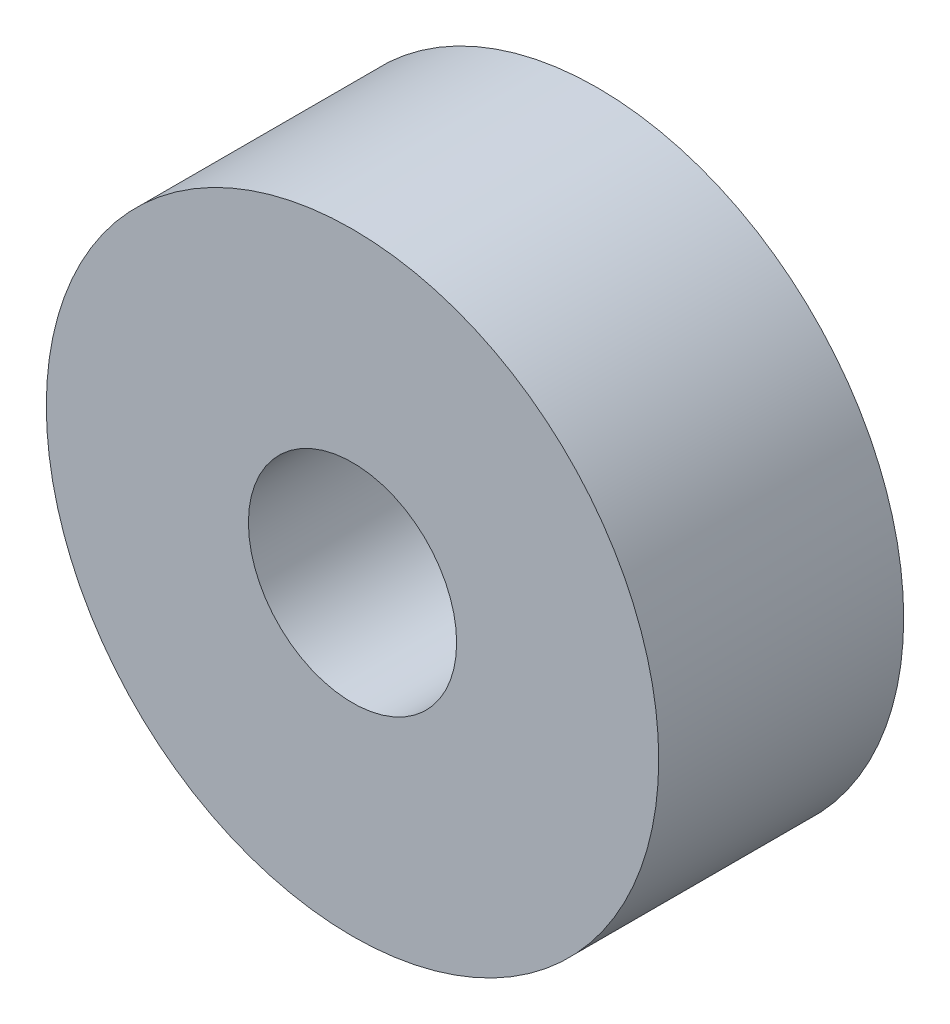
ISO-10303-21;
HEADER;
FILE_DESCRIPTION(('STEP AP214'),'2;1');
FILE_NAME('part.step','',(''),(''),'','','');
FILE_SCHEMA(('AUTOMOTIVE_DESIGN { 1 0 10303 214 1 1 1 1 }'));
ENDSEC;
DATA;
#1=APPLICATION_CONTEXT('core data for automotive mechanical design processes');
#2=APPLICATION_PROTOCOL_DEFINITION('international standard','automotive_design',2000,#1);
#3=PRODUCT_CONTEXT('',#1,'mechanical');
#4=PRODUCT('Part','Part','',(#3));
#5=PRODUCT_RELATED_PRODUCT_CATEGORY('part','',(#4));
#6=PRODUCT_DEFINITION_FORMATION('','',#4);
#7=PRODUCT_DEFINITION_CONTEXT('part definition',#1,'design');
#8=PRODUCT_DEFINITION('design','',#6,#7);
#9=PRODUCT_DEFINITION_SHAPE('','',#8);
#10=(LENGTH_UNIT() NAMED_UNIT(*) SI_UNIT(.MILLI.,.METRE.));
#11=(NAMED_UNIT(*) PLANE_ANGLE_UNIT() SI_UNIT($,.RADIAN.));
#12=(NAMED_UNIT(*) SI_UNIT($,.STERADIAN.) SOLID_ANGLE_UNIT());
#13=UNCERTAINTY_MEASURE_WITH_UNIT(LENGTH_MEASURE(1.E-05),#10,'distance_accuracy_value','');
#14=(GEOMETRIC_REPRESENTATION_CONTEXT(3) GLOBAL_UNCERTAINTY_ASSIGNED_CONTEXT((#13)) GLOBAL_UNIT_ASSIGNED_CONTEXT((#10,
#11,#12)) REPRESENTATION_CONTEXT('',''));
#15=CARTESIAN_POINT('',(0.,0.,0.));
#16=DIRECTION('',(0.,0.,1.));
#17=DIRECTION('',(1.,0.,0.));
#18=AXIS2_PLACEMENT_3D('',#15,#16,#17);
#19=CARTESIAN_POINT('',(0.,0.,4.));
#20=DIRECTION('',(0.,0.,1.));
#21=DIRECTION('',(1.,0.,0.));
#22=AXIS2_PLACEMENT_3D('',#19,#20,#21);
#23=PLANE('',#22);
#24=CARTESIAN_POINT('',(0.,0.,4.));
#25=DIRECTION('',(0.,0.,1.));
#26=DIRECTION('',(1.,0.,0.));
#27=AXIS2_PLACEMENT_3D('',#24,#25,#26);
#28=CIRCLE('',#27,5.);
#29=CARTESIAN_POINT('',(5.,0.,4.));
#30=VERTEX_POINT('',#29);
#31=EDGE_CURVE('E10',#30,#30,#28,.T.);
#32=ORIENTED_EDGE('',*,*,#31,.T.);
#33=EDGE_LOOP('',(#32));
#34=FACE_BOUND('',#33,.T.);
#35=CARTESIAN_POINT('',(0.,0.,4.));
#36=DIRECTION('',(0.,0.,1.));
#37=DIRECTION('',(1.,0.,0.));
#38=AXIS2_PLACEMENT_3D('',#35,#36,#37);
#39=CIRCLE('',#38,1.7);
#40=CARTESIAN_POINT('',(1.7,0.,4.));
#41=VERTEX_POINT('',#40);
#42=EDGE_CURVE('E50',#41,#41,#39,.T.);
#43=ORIENTED_EDGE('',*,*,#42,.F.);
#44=EDGE_LOOP('',(#43));
#45=FACE_BOUND('',#44,.T.);
#46=ADVANCED_FACE('F37',(#34,#45),#23,.T.);
#47=CARTESIAN_POINT('',(0.,0.,0.));
#48=DIRECTION('',(0.,0.,1.));
#49=DIRECTION('',(1.,0.,0.));
#50=AXIS2_PLACEMENT_3D('',#47,#48,#49);
#51=PLANE('',#50);
#52=CARTESIAN_POINT('',(0.,0.,0.));
#53=DIRECTION('',(0.,0.,1.));
#54=DIRECTION('',(1.,0.,0.));
#55=AXIS2_PLACEMENT_3D('',#52,#53,#54);
#56=CIRCLE('',#55,5.);
#57=CARTESIAN_POINT('',(5.,0.,0.));
#58=VERTEX_POINT('',#57);
#59=EDGE_CURVE('E41',#58,#58,#56,.T.);
#60=ORIENTED_EDGE('',*,*,#59,.F.);
#61=EDGE_LOOP('',(#60));
#62=FACE_BOUND('',#61,.T.);
#63=CARTESIAN_POINT('',(0.,0.,0.));
#64=DIRECTION('',(0.,0.,1.));
#65=DIRECTION('',(1.,0.,0.));
#66=AXIS2_PLACEMENT_3D('',#63,#64,#65);
#67=CIRCLE('',#66,1.7);
#68=CARTESIAN_POINT('',(1.7,0.,0.));
#69=VERTEX_POINT('',#68);
#70=EDGE_CURVE('E52',#69,#69,#67,.T.);
#71=ORIENTED_EDGE('',*,*,#70,.T.);
#72=EDGE_LOOP('',(#71));
#73=FACE_BOUND('',#72,.T.);
#74=ADVANCED_FACE('F64',(#62,#73),#51,.F.);
#75=CARTESIAN_POINT('',(0.,0.,4.));
#76=DIRECTION('',(0.,0.,-1.));
#77=DIRECTION('',(-1.,0.,0.));
#78=AXIS2_PLACEMENT_3D('',#75,#76,#77);
#79=CYLINDRICAL_SURFACE('',#78,5.);
#80=ORIENTED_EDGE('',*,*,#31,.F.);
#81=EDGE_LOOP('',(#80));
#82=FACE_BOUND('',#81,.T.);
#83=ORIENTED_EDGE('',*,*,#59,.T.);
#84=EDGE_LOOP('',(#83));
#85=FACE_BOUND('',#84,.T.);
#86=ADVANCED_FACE('F39',(#82,#85),#79,.T.);
#87=CARTESIAN_POINT('',(0.,0.,4.));
#88=DIRECTION('',(0.,0.,-1.));
#89=DIRECTION('',(-1.,0.,0.));
#90=AXIS2_PLACEMENT_3D('',#87,#88,#89);
#91=CYLINDRICAL_SURFACE('',#90,1.7);
#92=ORIENTED_EDGE('',*,*,#42,.T.);
#93=EDGE_LOOP('',(#92));
#94=FACE_BOUND('',#93,.T.);
#95=ORIENTED_EDGE('',*,*,#70,.F.);
#96=EDGE_LOOP('',(#95));
#97=FACE_BOUND('',#96,.T.);
#98=ADVANCED_FACE('F60',(#94,#97),#91,.F.);
#99=CLOSED_SHELL('',(#46,#74,#86,#98));
#100=MANIFOLD_SOLID_BREP('B2',#99);
#101=ADVANCED_BREP_SHAPE_REPRESENTATION('',(#18,#100),#14);
#102=SHAPE_DEFINITION_REPRESENTATION(#9,#101);
ENDSEC;
END-ISO-10303-21;
